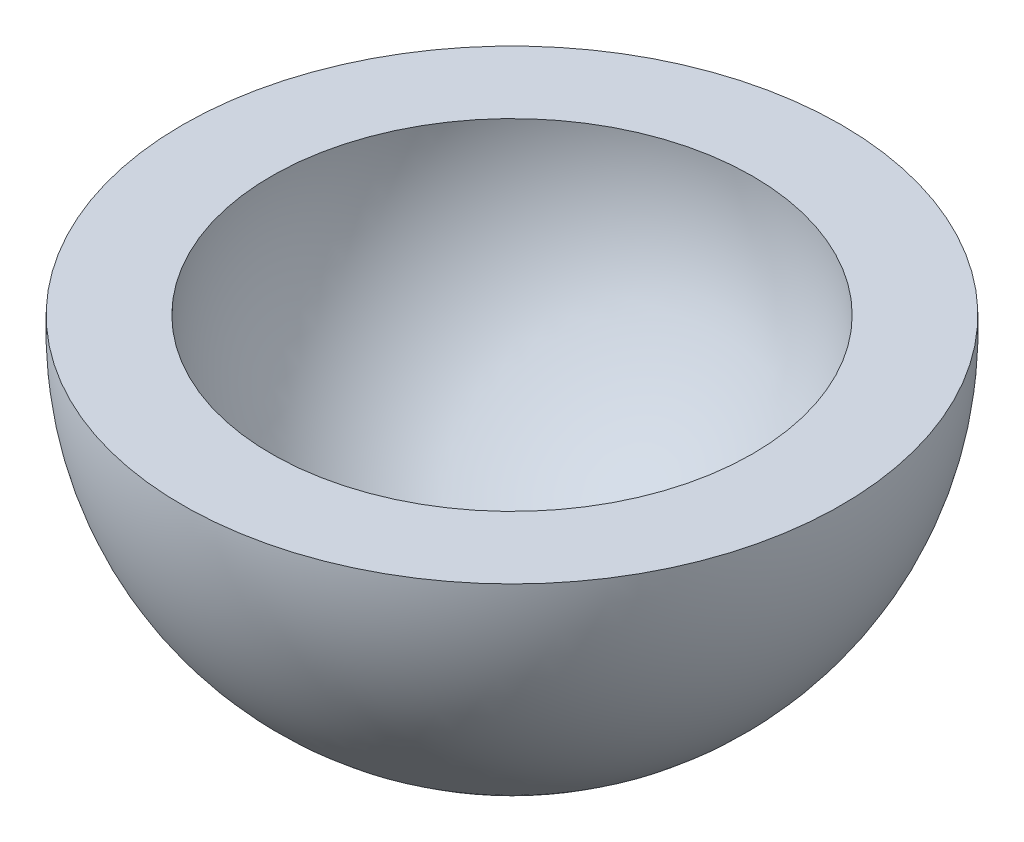
ISO-10303-21;
HEADER;
FILE_DESCRIPTION(('STEP AP214'),'2;1');
FILE_NAME('part.step','',(''),(''),'','','');
FILE_SCHEMA(('AUTOMOTIVE_DESIGN { 1 0 10303 214 1 1 1 1 }'));
ENDSEC;
DATA;
#1=APPLICATION_CONTEXT('core data for automotive mechanical design processes');
#2=APPLICATION_PROTOCOL_DEFINITION('international standard','automotive_design',2000,#1);
#3=PRODUCT_CONTEXT('',#1,'mechanical');
#4=PRODUCT('Part','Part','',(#3));
#5=PRODUCT_RELATED_PRODUCT_CATEGORY('part','',(#4));
#6=PRODUCT_DEFINITION_FORMATION('','',#4);
#7=PRODUCT_DEFINITION_CONTEXT('part definition',#1,'design');
#8=PRODUCT_DEFINITION('design','',#6,#7);
#9=PRODUCT_DEFINITION_SHAPE('','',#8);
#10=(LENGTH_UNIT() NAMED_UNIT(*) SI_UNIT(.MILLI.,.METRE.));
#11=(NAMED_UNIT(*) PLANE_ANGLE_UNIT() SI_UNIT($,.RADIAN.));
#12=(NAMED_UNIT(*) SI_UNIT($,.STERADIAN.) SOLID_ANGLE_UNIT());
#13=UNCERTAINTY_MEASURE_WITH_UNIT(LENGTH_MEASURE(1.E-05),#10,'distance_accuracy_value','');
#14=(GEOMETRIC_REPRESENTATION_CONTEXT(3) GLOBAL_UNCERTAINTY_ASSIGNED_CONTEXT((#13)) GLOBAL_UNIT_ASSIGNED_CONTEXT((#10,
#11,#12)) REPRESENTATION_CONTEXT('',''));
#15=CARTESIAN_POINT('',(0.,0.,0.));
#16=DIRECTION('',(0.,0.,1.));
#17=DIRECTION('',(1.,0.,0.));
#18=AXIS2_PLACEMENT_3D('',#15,#16,#17);
#19=CARTESIAN_POINT('',(0.,0.,0.));
#20=DIRECTION('',(0.,-1.,0.));
#21=DIRECTION('',(1.,0.,0.));
#22=AXIS2_PLACEMENT_3D('',#19,#20,#21);
#23=SPHERICAL_SURFACE('',#22,190.);
#24=CARTESIAN_POINT('',(0.,10.,0.));
#25=DIRECTION('',(0.,-1.,0.));
#26=DIRECTION('',(0.,0.,-1.));
#27=AXIS2_PLACEMENT_3D('',#24,#25,#26);
#28=CIRCLE('',#27,189.736659610103);
#29=CARTESIAN_POINT('',(0.,10.,-189.736659610103));
#30=VERTEX_POINT('',#29);
#31=EDGE_CURVE('E60',#30,#30,#28,.T.);
#32=ORIENTED_EDGE('',*,*,#31,.F.);
#33=EDGE_LOOP('',(#32));
#34=FACE_BOUND('',#33,.T.);
#35=ADVANCED_FACE('F42',(#34),#23,.F.);
#36=CARTESIAN_POINT('',(0.,0.,0.));
#37=DIRECTION('',(0.,-1.,0.));
#38=DIRECTION('',(-1.,0.,0.));
#39=AXIS2_PLACEMENT_3D('',#36,#37,#38);
#40=SPHERICAL_SURFACE('',#39,260.);
#41=CARTESIAN_POINT('',(0.,10.,0.));
#42=DIRECTION('',(0.,-1.,0.));
#43=DIRECTION('',(0.,0.,-1.));
#44=AXIS2_PLACEMENT_3D('',#41,#42,#43);
#45=CIRCLE('',#44,259.807621135332);
#46=CARTESIAN_POINT('',(0.,10.,-259.807621135332));
#47=VERTEX_POINT('',#46);
#48=EDGE_CURVE('E55',#47,#47,#45,.T.);
#49=ORIENTED_EDGE('',*,*,#48,.T.);
#50=EDGE_LOOP('',(#49));
#51=FACE_BOUND('',#50,.T.);
#52=ADVANCED_FACE('F71',(#51),#40,.T.);
#53=CARTESIAN_POINT('',(200.,10.,0.));
#54=DIRECTION('',(0.,1.,0.));
#55=DIRECTION('',(0.,0.,1.));
#56=AXIS2_PLACEMENT_3D('',#53,#54,#55);
#57=PLANE('',#56);
#58=ORIENTED_EDGE('',*,*,#31,.T.);
#59=EDGE_LOOP('',(#58));
#60=FACE_BOUND('',#59,.T.);
#61=ORIENTED_EDGE('',*,*,#48,.F.);
#62=EDGE_LOOP('',(#61));
#63=FACE_BOUND('',#62,.T.);
#64=ADVANCED_FACE('F67',(#60,#63),#57,.T.);
#65=CLOSED_SHELL('',(#35,#52,#64));
#66=CARTESIAN_POINT('',(0.,0.,0.));
#67=DIRECTION('',(0.,-1.,0.));
#68=DIRECTION('',(1.,0.,0.));
#69=AXIS2_PLACEMENT_3D('',#66,#67,#68);
#70=SPHERICAL_SURFACE('',#69,200.);
#71=CARTESIAN_POINT('',(0.,0.,0.));
#72=DIRECTION('',(0.,-1.,0.));
#73=DIRECTION('',(0.,0.,-1.));
#74=AXIS2_PLACEMENT_3D('',#71,#72,#73);
#75=CIRCLE('',#74,200.);
#76=CARTESIAN_POINT('',(0.,0.,-200.));
#77=VERTEX_POINT('',#76);
#78=EDGE_CURVE('E10',#77,#77,#75,.T.);
#79=ORIENTED_EDGE('',*,*,#78,.T.);
#80=EDGE_LOOP('',(#79));
#81=FACE_BOUND('',#80,.T.);
#82=ADVANCED_FACE('F89',(#81),#70,.T.);
#83=CARTESIAN_POINT('',(200.,0.,0.));
#84=DIRECTION('',(0.,1.,0.));
#85=DIRECTION('',(0.,0.,1.));
#86=AXIS2_PLACEMENT_3D('',#83,#84,#85);
#87=PLANE('',#86);
#88=ORIENTED_EDGE('',*,*,#78,.F.);
#89=EDGE_LOOP('',(#88));
#90=FACE_BOUND('',#89,.T.);
#91=CARTESIAN_POINT('',(0.,0.,0.));
#92=DIRECTION('',(0.,-1.,0.));
#93=DIRECTION('',(0.,0.,-1.));
#94=AXIS2_PLACEMENT_3D('',#91,#92,#93);
#95=CIRCLE('',#94,250.);
#96=CARTESIAN_POINT('',(0.,0.,-250.));
#97=VERTEX_POINT('',#96);
#98=EDGE_CURVE('E50',#97,#97,#95,.T.);
#99=ORIENTED_EDGE('',*,*,#98,.T.);
#100=EDGE_LOOP('',(#99));
#101=FACE_BOUND('',#100,.T.);
#102=ADVANCED_FACE('F85',(#90,#101),#87,.F.);
#103=CARTESIAN_POINT('',(0.,0.,0.));
#104=DIRECTION('',(0.,-1.,0.));
#105=DIRECTION('',(-1.,0.,0.));
#106=AXIS2_PLACEMENT_3D('',#103,#104,#105);
#107=SPHERICAL_SURFACE('',#106,250.);
#108=ORIENTED_EDGE('',*,*,#98,.F.);
#109=EDGE_LOOP('',(#108));
#110=FACE_BOUND('',#109,.T.);
#111=ADVANCED_FACE('F82',(#110),#107,.F.);
#112=CLOSED_SHELL('',(#82,#102,#111));
#113=ORIENTED_CLOSED_SHELL('',*,#112,.T.);
#114=BREP_WITH_VOIDS('B2',#65,(#113));
#115=ADVANCED_BREP_SHAPE_REPRESENTATION('',(#18,#114),#14);
#116=SHAPE_DEFINITION_REPRESENTATION(#9,#115);
ENDSEC;
END-ISO-10303-21;
